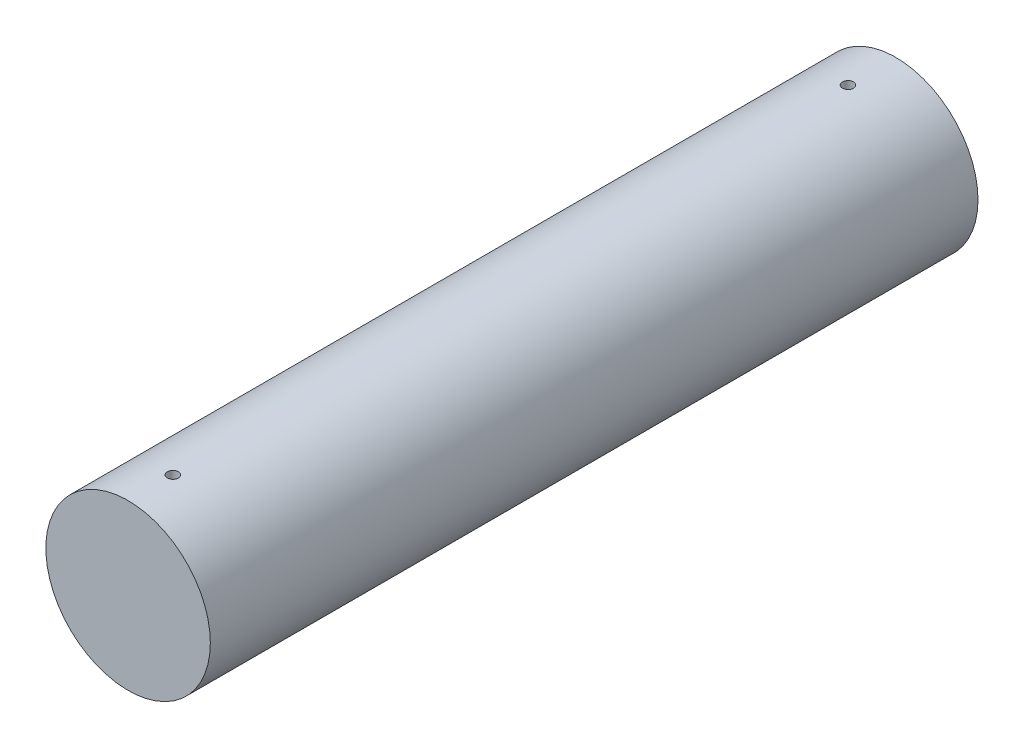
ISO-10303-21;
HEADER;
FILE_DESCRIPTION(('STEP AP214'),'2;1');
FILE_NAME('part.step','',(''),(''),'','','');
FILE_SCHEMA(('AUTOMOTIVE_DESIGN { 1 0 10303 214 1 1 1 1 }'));
ENDSEC;
DATA;
#1=APPLICATION_CONTEXT('core data for automotive mechanical design processes');
#2=APPLICATION_PROTOCOL_DEFINITION('international standard','automotive_design',2000,#1);
#3=PRODUCT_CONTEXT('',#1,'mechanical');
#4=PRODUCT('Part','Part','',(#3));
#5=PRODUCT_RELATED_PRODUCT_CATEGORY('part','',(#4));
#6=PRODUCT_DEFINITION_FORMATION('','',#4);
#7=PRODUCT_DEFINITION_CONTEXT('part definition',#1,'design');
#8=PRODUCT_DEFINITION('design','',#6,#7);
#9=PRODUCT_DEFINITION_SHAPE('','',#8);
#10=(LENGTH_UNIT() NAMED_UNIT(*) SI_UNIT(.MILLI.,.METRE.));
#11=(NAMED_UNIT(*) PLANE_ANGLE_UNIT() SI_UNIT($,.RADIAN.));
#12=(NAMED_UNIT(*) SI_UNIT($,.STERADIAN.) SOLID_ANGLE_UNIT());
#13=UNCERTAINTY_MEASURE_WITH_UNIT(LENGTH_MEASURE(1.E-05),#10,'distance_accuracy_value','');
#14=(GEOMETRIC_REPRESENTATION_CONTEXT(3) GLOBAL_UNCERTAINTY_ASSIGNED_CONTEXT((#13)) GLOBAL_UNIT_ASSIGNED_CONTEXT((#10,
#11,#12)) REPRESENTATION_CONTEXT('',''));
#15=CARTESIAN_POINT('',(0.,0.,0.));
#16=DIRECTION('',(0.,0.,1.));
#17=DIRECTION('',(1.,0.,0.));
#18=AXIS2_PLACEMENT_3D('',#15,#16,#17);
#19=CARTESIAN_POINT('',(0.,0.,700.));
#20=DIRECTION('',(0.,0.,-1.));
#21=DIRECTION('',(-1.,0.,0.));
#22=AXIS2_PLACEMENT_3D('',#19,#20,#21);
#23=CYLINDRICAL_SURFACE('',#22,75.);
#24=CARTESIAN_POINT('',(0.,-75.,664.262651619664));
#25=CARTESIAN_POINT('',(0.140309097466806,-75.0000002142623,664.262652786667));
#26=CARTESIAN_POINT('',(0.280599661851319,-74.9996054525654,664.256743286183));
#27=CARTESIAN_POINT('',(0.560228122354219,-74.9980378910327,664.233147683491));
#28=CARTESIAN_POINT('',(0.699565768668017,-74.9968648945306,664.215458604485));
#29=CARTESIAN_POINT('',(0.976366792558886,-74.9937723135742,664.168406906699));
#30=CARTESIAN_POINT('',(1.11382847572406,-74.9918520951518,664.139034374815));
#31=CARTESIAN_POINT('',(1.38583180784089,-74.9873187869064,664.068814938189));
#32=CARTESIAN_POINT('',(1.52037236964976,-74.9847054437505,664.027963837775));
#33=CARTESIAN_POINT('',(1.7854045781585,-74.9788629279762,663.935127213686));
#34=CARTESIAN_POINT('',(1.91589977424419,-74.975634314059,663.88315178631));
#35=CARTESIAN_POINT('',(2.17209218694026,-74.968649744152,663.768395024603));
#36=CARTESIAN_POINT('',(2.29778761648233,-74.9648935941364,663.705609712509));
#37=CARTESIAN_POINT('',(2.54336741338075,-74.9569634447306,663.569734554365));
#38=CARTESIAN_POINT('',(2.66325520712709,-74.9527896962832,663.496650886139));
#39=CARTESIAN_POINT('',(2.89649799773825,-74.9441387055542,663.340640340649));
#40=CARTESIAN_POINT('',(3.00985056305832,-74.9396613516422,663.257709834364));
#41=CARTESIAN_POINT('',(3.22929868522604,-74.9305258660933,663.082516096984));
#42=CARTESIAN_POINT('',(3.33538597969088,-74.9258675377759,662.990242526589));
#43=CARTESIAN_POINT('',(3.53945256212238,-74.9165049575525,662.797057340851));
#44=CARTESIAN_POINT('',(3.63742884029323,-74.9118006893167,662.696142546974));
#45=CARTESIAN_POINT('',(3.8245059361272,-74.9024827735211,662.486452138175));
#46=CARTESIAN_POINT('',(3.91360964113651,-74.8978690968756,662.377679100528));
#47=CARTESIAN_POINT('',(4.08237803772129,-74.8888598915233,662.152970177327));
#48=CARTESIAN_POINT('',(4.16203923307435,-74.8844644439669,662.037031662679));
#49=CARTESIAN_POINT('',(4.31135978107555,-74.8760160211824,661.798780888551));
#50=CARTESIAN_POINT('',(4.38101356268214,-74.8719632372248,661.676465130152));
#51=CARTESIAN_POINT('',(4.50979330078907,-74.8643167797411,661.426343250814));
#52=CARTESIAN_POINT('',(4.56891535531324,-74.860723276516,661.298535116642));
#53=CARTESIAN_POINT('',(4.67615623582472,-74.8541011443197,661.038414917157));
#54=CARTESIAN_POINT('',(4.7242792236099,-74.8510723017738,660.90610457722));
#55=CARTESIAN_POINT('',(4.80921896313872,-74.8456625066541,660.637875913649));
#56=CARTESIAN_POINT('',(4.84603154191175,-74.843281793244,660.501956278411));
#57=CARTESIAN_POINT('',(4.93892346609777,-74.8372307668651,660.090737687158));
#58=CARTESIAN_POINT('',(4.97773600736569,-74.8346337485122,659.81130038798));
#59=CARTESIAN_POINT('',(5.00788806213435,-74.8326215616604,659.25001772025));
#60=CARTESIAN_POINT('',(4.99922817577027,-74.8332063529378,658.968172382185));
#61=CARTESIAN_POINT('',(4.93480047140913,-74.8374824103477,658.41036357694));
#62=CARTESIAN_POINT('',(4.87910802554584,-74.841168706122,658.134391422693));
#63=CARTESIAN_POINT('',(4.72229658614057,-74.851225989118,657.595732129575));
#64=CARTESIAN_POINT('',(4.6211772898544,-74.8575969942318,657.333045079254));
#65=CARTESIAN_POINT('',(4.37630158009315,-74.8723110865371,656.828157562337));
#66=CARTESIAN_POINT('',(4.23251103339704,-74.8806557513928,656.585973696563));
#67=CARTESIAN_POINT('',(3.90639803709198,-74.8983753551486,656.129152338718));
#68=CARTESIAN_POINT('',(3.72407509267484,-74.9077503072782,655.914515200439));
#69=CARTESIAN_POINT('',(3.32564878468843,-74.9264960886397,655.518440504709));
#70=CARTESIAN_POINT('',(3.10948018577249,-74.9358668741139,655.337068561072));
#71=CARTESIAN_POINT('',(2.6497272135033,-74.9535307835251,655.013179318679));
#72=CARTESIAN_POINT('',(2.40614282928457,-74.9618239070351,654.870662035322));
#73=CARTESIAN_POINT('',(1.89843247226829,-74.9763988097376,654.628532880183));
#74=CARTESIAN_POINT('',(1.63430527507026,-74.9826804689275,654.528923568136));
#75=CARTESIAN_POINT('',(1.09302498078505,-74.9925230471413,654.375482120778));
#76=CARTESIAN_POINT('',(0.815872056792231,-74.9960840023087,654.321649377339));
#77=CARTESIAN_POINT('',(0.2569768554895,-75.0000792671833,654.261370648366));
#78=CARTESIAN_POINT('',(-0.0247555983855488,-75.0005195615152,654.254833960661));
#79=CARTESIAN_POINT('',(-0.585312858226678,-74.9982398216164,654.289095802122));
#80=CARTESIAN_POINT('',(-0.864137681430661,-74.9955198061323,654.329894050502));
#81=CARTESIAN_POINT('',(-1.41070880311822,-74.9872294467462,654.45759251706));
#82=CARTESIAN_POINT('',(-1.67846488427835,-74.9816616805624,654.544451045148));
#83=CARTESIAN_POINT('',(-2.19560003833741,-74.9683020439888,654.761762164497));
#84=CARTESIAN_POINT('',(-2.44497892340134,-74.9605101508699,654.892215201267));
#85=CARTESIAN_POINT('',(-2.91869566338917,-74.9435624933126,655.193242357636));
#86=CARTESIAN_POINT('',(-3.14299500423924,-74.9344046802577,655.363876968236));
#87=CARTESIAN_POINT('',(-3.55979761406041,-74.915762390613,655.740336653248));
#88=CARTESIAN_POINT('',(-3.75230052788653,-74.9062779103758,655.946162120666));
#89=CARTESIAN_POINT('',(-4.10035416778083,-74.8880337793342,656.387548880683));
#90=CARTESIAN_POINT('',(-4.25584598925372,-74.8792752982326,656.623156672708));
#91=CARTESIAN_POINT('',(-4.52505903306866,-74.8634898260947,657.117200695533));
#92=CARTESIAN_POINT('',(-4.63878054167474,-74.8564628231922,657.37563676987));
#93=CARTESIAN_POINT('',(-4.82112861711831,-74.8449403721188,657.907735150177));
#94=CARTESIAN_POINT('',(-4.88979207451111,-74.8404428534058,658.181384800639));
#95=CARTESIAN_POINT('',(-4.98017484611744,-74.834484081991,658.736512768525));
#96=CARTESIAN_POINT('',(-5.00189470292963,-74.8330227941948,659.017990995425));
#97=CARTESIAN_POINT('',(-4.99885527855369,-74.8332233940056,659.439391653871));
#98=CARTESIAN_POINT('',(-4.99191643673334,-74.8336882886248,659.579661119362));
#99=CARTESIAN_POINT('',(-4.96627572312488,-74.8353947208124,659.859101989463));
#100=CARTESIAN_POINT('',(-4.94757820386329,-74.8366359710085,659.998273781092));
#101=CARTESIAN_POINT('',(-4.89854032446997,-74.8398616831956,660.274584875579));
#102=CARTESIAN_POINT('',(-4.86819566729886,-74.8418464194783,660.411723408881));
#103=CARTESIAN_POINT('',(-4.79609789208626,-74.8465012566181,660.682904645106));
#104=CARTESIAN_POINT('',(-4.75434896910654,-74.8491711054347,660.816948466795));
#105=CARTESIAN_POINT('',(-4.65971948772504,-74.8551218025797,661.081085875554));
#106=CARTESIAN_POINT('',(-4.60683502586751,-74.8584028651166,661.21117805907));
#107=CARTESIAN_POINT('',(-4.490342625321,-74.8654808635214,661.466396701432));
#108=CARTESIAN_POINT('',(-4.42673863049181,-74.8692776095631,661.591524965729));
#109=CARTESIAN_POINT('',(-4.28922238053104,-74.8772816957576,661.836025070392));
#110=CARTESIAN_POINT('',(-4.2153066184035,-74.8814891754527,661.955394933679));
#111=CARTESIAN_POINT('',(-4.05773644480292,-74.8901929225954,662.187448557121));
#112=CARTESIAN_POINT('',(-3.97408560947426,-74.8946890837265,662.300134749676));
#113=CARTESIAN_POINT('',(-3.7974199368615,-74.9038546393966,662.518315686261));
#114=CARTESIAN_POINT('',(-3.70438488578406,-74.9085243935924,662.623794048439));
#115=CARTESIAN_POINT('',(-3.50979940307429,-74.9178936542641,662.826503418249));
#116=CARTESIAN_POINT('',(-3.40825211066732,-74.9225931491861,662.923737439927));
#117=CARTESIAN_POINT('',(-3.19726521769517,-74.9318934063755,663.109371126658));
#118=CARTESIAN_POINT('',(-3.08782081434678,-74.9364941063141,663.197765336306));
#119=CARTESIAN_POINT('',(-2.86191065606887,-74.9454617637456,663.364993684085));
#120=CARTESIAN_POINT('',(-2.74544750640933,-74.9498288068465,663.443831337164));
#121=CARTESIAN_POINT('',(-2.50608067203498,-74.9582145124586,663.591551328823));
#122=CARTESIAN_POINT('',(-2.38316626681391,-74.962232563598,663.660416332478));
#123=CARTESIAN_POINT('',(-2.13200113257577,-74.9697962473238,663.787513389988));
#124=CARTESIAN_POINT('',(-2.00375237478967,-74.9733420524218,663.845749329538));
#125=CARTESIAN_POINT('',(-1.74289730688684,-74.9798593681947,663.951156585765));
#126=CARTESIAN_POINT('',(-1.61029484285664,-74.9828313706044,663.998337383899));
#127=CARTESIAN_POINT('',(-1.3416176363287,-74.9881198589993,664.081347714749));
#128=CARTESIAN_POINT('',(-1.20554378943699,-74.9904365122347,664.117180143937));
#129=CARTESIAN_POINT('',(-0.892938525441979,-74.9948887353417,664.18553935565));
#130=CARTESIAN_POINT('',(-0.715596937189605,-74.996798250881,664.214430503079));
#131=CARTESIAN_POINT('',(-0.358826797775219,-74.9993537452255,664.252985873692));
#132=CARTESIAN_POINT('',(-0.179398249942198,-74.9999997260458,664.262650127541));
#133=CARTESIAN_POINT('',(0.,-75.,664.262651619664));
#134=B_SPLINE_CURVE_WITH_KNOTS('',3,(#24,#25,#26,#27,#28,#29,#30,#31,#32,#33,#34,#35,#36,#37,
#38,#39,#40,#41,#42,#43,#44,#45,#46,#47,#48,#49,#50,#51,#52,#53,#54,#55,#56,#57,#58,#59,#60,#61,
#62,#63,#64,#65,#66,#67,#68,#69,#70,#71,#72,#73,#74,#75,#76,#77,#78,#79,#80,#81,#82,#83,#84,#85,
#86,#87,#88,#89,#90,#91,#92,#93,#94,#95,#96,#97,#98,#99,#100,#101,#102,#103,#104,#105,#106,#107,
#108,#109,#110,#111,#112,#113,#114,#115,#116,#117,#118,#119,#120,#121,#122,#123,#124,#125,#126,
#127,#128,#129,#130,#131,#132,#133),.UNSPECIFIED.,.T.,.F.,(4,2,2,2,2,2,2,2,2,2,2,2,2,2,2,2,2,2,
2,2,2,2,2,2,2,2,2,2,2,2,2,2,2,2,2,2,2,2,2,2,2,2,2,2,2,2,2,2,2,2,2,2,2,2,4),(0.,
0.420770514295968,0.841647401180651,1.26288215542827,1.68427108109799,2.10527916914108,
2.52644250986049,2.94735426839671,3.36842163697439,3.78996017178945,4.21165443436656,
4.63321101602462,5.0549232005823,5.47686924654402,5.89897129868547,6.32091337158426,
6.74301093340767,7.58503195248827,8.42704232696327,9.26770589080927,10.1083750572844,
10.949718505614,11.7910727585898,12.6340690977974,13.4770657711035,14.3201127275758,
15.1631484842557,16.0045670767168,16.8459806779845,17.6866339954179,18.5272959040545,
19.3692315631886,20.2111766255494,21.054452848191,21.897723291509,22.7403024564356,
23.5828718823402,24.0037877483546,24.4245479021268,24.8454634385803,25.2662243491793,
25.6871329997355,26.107887129071,26.5287847058528,26.9495281525763,27.3711980701731,
27.7927131587712,28.2144867965581,28.6361048302076,29.0584471625143,29.4806347874443,
29.9024589862439,30.3241754348709,30.8621705873475,31.4001648817647),.UNSPECIFIED.);
#135=CARTESIAN_POINT('',(0.,-75.,664.262651619664));
#136=VERTEX_POINT('',#135);
#137=EDGE_CURVE('E10',#136,#136,#134,.T.);
#138=ORIENTED_EDGE('',*,*,#137,.T.);
#139=EDGE_LOOP('',(#138));
#140=FACE_BOUND('',#139,.T.);
#141=CARTESIAN_POINT('',(0.,75.,664.262651619664));
#142=CARTESIAN_POINT('',(-0.140309097466806,75.0000002142623,664.262652786667));
#143=CARTESIAN_POINT('',(-0.280599661851319,74.9996054525654,664.256743286183));
#144=CARTESIAN_POINT('',(-0.560228122354219,74.9980378910327,664.233147683491));
#145=CARTESIAN_POINT('',(-0.699565768668017,74.9968648945306,664.215458604485));
#146=CARTESIAN_POINT('',(-0.976366792558886,74.9937723135742,664.168406906699));
#147=CARTESIAN_POINT('',(-1.11382847572406,74.9918520951518,664.139034374815));
#148=CARTESIAN_POINT('',(-1.38583180784089,74.9873187869064,664.068814938189));
#149=CARTESIAN_POINT('',(-1.52037236964976,74.9847054437505,664.027963837775));
#150=CARTESIAN_POINT('',(-1.7854045781585,74.9788629279762,663.935127213686));
#151=CARTESIAN_POINT('',(-1.91589977424419,74.975634314059,663.88315178631));
#152=CARTESIAN_POINT('',(-2.17209218694026,74.968649744152,663.768395024603));
#153=CARTESIAN_POINT('',(-2.29778761648233,74.9648935941364,663.705609712509));
#154=CARTESIAN_POINT('',(-2.54336741338075,74.9569634447306,663.569734554365));
#155=CARTESIAN_POINT('',(-2.66325520712709,74.9527896962832,663.496650886139));
#156=CARTESIAN_POINT('',(-2.89649799773825,74.9441387055542,663.340640340649));
#157=CARTESIAN_POINT('',(-3.00985056305832,74.9396613516422,663.257709834364));
#158=CARTESIAN_POINT('',(-3.22929868522604,74.9305258660933,663.082516096984));
#159=CARTESIAN_POINT('',(-3.33538597969088,74.9258675377759,662.990242526589));
#160=CARTESIAN_POINT('',(-3.53945256212238,74.9165049575525,662.797057340851));
#161=CARTESIAN_POINT('',(-3.63742884029323,74.9118006893167,662.696142546974));
#162=CARTESIAN_POINT('',(-3.8245059361272,74.9024827735211,662.486452138175));
#163=CARTESIAN_POINT('',(-3.91360964113651,74.8978690968756,662.377679100528));
#164=CARTESIAN_POINT('',(-4.08237803772129,74.8888598915233,662.152970177327));
#165=CARTESIAN_POINT('',(-4.16203923307435,74.8844644439669,662.037031662679));
#166=CARTESIAN_POINT('',(-4.31135978107555,74.8760160211824,661.798780888551));
#167=CARTESIAN_POINT('',(-4.38101356268214,74.8719632372248,661.676465130152));
#168=CARTESIAN_POINT('',(-4.50979330078907,74.8643167797411,661.426343250814));
#169=CARTESIAN_POINT('',(-4.56891535531324,74.860723276516,661.298535116642));
#170=CARTESIAN_POINT('',(-4.67615623582472,74.8541011443197,661.038414917157));
#171=CARTESIAN_POINT('',(-4.7242792236099,74.8510723017738,660.90610457722));
#172=CARTESIAN_POINT('',(-4.80921896313872,74.8456625066541,660.637875913649));
#173=CARTESIAN_POINT('',(-4.84603154191175,74.843281793244,660.501956278411));
#174=CARTESIAN_POINT('',(-4.93892346609777,74.8372307668651,660.090737687158));
#175=CARTESIAN_POINT('',(-4.97773600736569,74.8346337485122,659.81130038798));
#176=CARTESIAN_POINT('',(-5.00788806213435,74.8326215616604,659.25001772025));
#177=CARTESIAN_POINT('',(-4.99922817577027,74.8332063529378,658.968172382185));
#178=CARTESIAN_POINT('',(-4.93480047140913,74.8374824103477,658.41036357694));
#179=CARTESIAN_POINT('',(-4.87910802554584,74.841168706122,658.134391422693));
#180=CARTESIAN_POINT('',(-4.72229658614057,74.851225989118,657.595732129575));
#181=CARTESIAN_POINT('',(-4.6211772898544,74.8575969942318,657.333045079254));
#182=CARTESIAN_POINT('',(-4.37630158009315,74.8723110865371,656.828157562337));
#183=CARTESIAN_POINT('',(-4.23251103339704,74.8806557513928,656.585973696563));
#184=CARTESIAN_POINT('',(-3.90639803709198,74.8983753551486,656.129152338718));
#185=CARTESIAN_POINT('',(-3.72407509267484,74.9077503072782,655.914515200439));
#186=CARTESIAN_POINT('',(-3.32564878468843,74.9264960886397,655.518440504709));
#187=CARTESIAN_POINT('',(-3.10948018577249,74.9358668741139,655.337068561072));
#188=CARTESIAN_POINT('',(-2.6497272135033,74.9535307835251,655.013179318679));
#189=CARTESIAN_POINT('',(-2.40614282928457,74.9618239070351,654.870662035322));
#190=CARTESIAN_POINT('',(-1.89843247226829,74.9763988097376,654.628532880183));
#191=CARTESIAN_POINT('',(-1.63430527507026,74.9826804689275,654.528923568136));
#192=CARTESIAN_POINT('',(-1.09302498078505,74.9925230471413,654.375482120778));
#193=CARTESIAN_POINT('',(-0.815872056792231,74.9960840023087,654.321649377339));
#194=CARTESIAN_POINT('',(-0.2569768554895,75.0000792671833,654.261370648366));
#195=CARTESIAN_POINT('',(0.0247555983855488,75.0005195615152,654.254833960661));
#196=CARTESIAN_POINT('',(0.585312858226678,74.9982398216164,654.289095802122));
#197=CARTESIAN_POINT('',(0.864137681430661,74.9955198061323,654.329894050502));
#198=CARTESIAN_POINT('',(1.41070880311822,74.9872294467462,654.45759251706));
#199=CARTESIAN_POINT('',(1.67846488427835,74.9816616805624,654.544451045148));
#200=CARTESIAN_POINT('',(2.19560003833741,74.9683020439888,654.761762164497));
#201=CARTESIAN_POINT('',(2.44497892340134,74.9605101508699,654.892215201267));
#202=CARTESIAN_POINT('',(2.91869566338917,74.9435624933126,655.193242357636));
#203=CARTESIAN_POINT('',(3.14299500423924,74.9344046802577,655.363876968236));
#204=CARTESIAN_POINT('',(3.55979761406041,74.915762390613,655.740336653248));
#205=CARTESIAN_POINT('',(3.75230052788653,74.9062779103758,655.946162120666));
#206=CARTESIAN_POINT('',(4.10035416778083,74.8880337793342,656.387548880683));
#207=CARTESIAN_POINT('',(4.25584598925372,74.8792752982326,656.623156672708));
#208=CARTESIAN_POINT('',(4.52505903306866,74.8634898260947,657.117200695533));
#209=CARTESIAN_POINT('',(4.63878054167474,74.8564628231922,657.37563676987));
#210=CARTESIAN_POINT('',(4.82112861711831,74.8449403721188,657.907735150177));
#211=CARTESIAN_POINT('',(4.88979207451111,74.8404428534058,658.181384800639));
#212=CARTESIAN_POINT('',(4.98017484611744,74.834484081991,658.736512768525));
#213=CARTESIAN_POINT('',(5.00189470292963,74.8330227941948,659.017990995425));
#214=CARTESIAN_POINT('',(4.99885527855369,74.8332233940056,659.439391653871));
#215=CARTESIAN_POINT('',(4.99191643673334,74.8336882886248,659.579661119362));
#216=CARTESIAN_POINT('',(4.96627572312488,74.8353947208124,659.859101989463));
#217=CARTESIAN_POINT('',(4.94757820386329,74.8366359710085,659.998273781092));
#218=CARTESIAN_POINT('',(4.89854032446997,74.8398616831956,660.274584875579));
#219=CARTESIAN_POINT('',(4.86819566729886,74.8418464194783,660.411723408881));
#220=CARTESIAN_POINT('',(4.79609789208626,74.8465012566181,660.682904645106));
#221=CARTESIAN_POINT('',(4.75434896910654,74.8491711054347,660.816948466795));
#222=CARTESIAN_POINT('',(4.65971948772504,74.8551218025797,661.081085875554));
#223=CARTESIAN_POINT('',(4.60683502586751,74.8584028651166,661.21117805907));
#224=CARTESIAN_POINT('',(4.490342625321,74.8654808635214,661.466396701432));
#225=CARTESIAN_POINT('',(4.42673863049181,74.8692776095631,661.591524965729));
#226=CARTESIAN_POINT('',(4.28922238053104,74.8772816957576,661.836025070392));
#227=CARTESIAN_POINT('',(4.2153066184035,74.8814891754527,661.955394933679));
#228=CARTESIAN_POINT('',(4.05773644480292,74.8901929225954,662.187448557121));
#229=CARTESIAN_POINT('',(3.97408560947426,74.8946890837265,662.300134749676));
#230=CARTESIAN_POINT('',(3.7974199368615,74.9038546393966,662.518315686261));
#231=CARTESIAN_POINT('',(3.70438488578406,74.9085243935924,662.623794048439));
#232=CARTESIAN_POINT('',(3.50979940307429,74.9178936542641,662.826503418249));
#233=CARTESIAN_POINT('',(3.40825211066732,74.9225931491861,662.923737439927));
#234=CARTESIAN_POINT('',(3.19726521769517,74.9318934063755,663.109371126658));
#235=CARTESIAN_POINT('',(3.08782081434678,74.9364941063141,663.197765336306));
#236=CARTESIAN_POINT('',(2.86191065606887,74.9454617637456,663.364993684085));
#237=CARTESIAN_POINT('',(2.74544750640933,74.9498288068465,663.443831337164));
#238=CARTESIAN_POINT('',(2.50608067203498,74.9582145124586,663.591551328823));
#239=CARTESIAN_POINT('',(2.38316626681391,74.962232563598,663.660416332478));
#240=CARTESIAN_POINT('',(2.13200113257577,74.9697962473238,663.787513389988));
#241=CARTESIAN_POINT('',(2.00375237478967,74.9733420524218,663.845749329538));
#242=CARTESIAN_POINT('',(1.74289730688684,74.9798593681947,663.951156585765));
#243=CARTESIAN_POINT('',(1.61029484285664,74.9828313706044,663.998337383899));
#244=CARTESIAN_POINT('',(1.3416176363287,74.9881198589993,664.081347714749));
#245=CARTESIAN_POINT('',(1.20554378943699,74.9904365122347,664.117180143937));
#246=CARTESIAN_POINT('',(0.892938525441979,74.9948887353417,664.18553935565));
#247=CARTESIAN_POINT('',(0.715596937189605,74.996798250881,664.214430503079));
#248=CARTESIAN_POINT('',(0.358826797775219,74.9993537452255,664.252985873692));
#249=CARTESIAN_POINT('',(0.179398249942198,74.9999997260458,664.262650127541));
#250=CARTESIAN_POINT('',(0.,75.,664.262651619664));
#251=B_SPLINE_CURVE_WITH_KNOTS('',3,(#141,#142,#143,#144,#145,#146,#147,#148,#149,#150,#151,
#152,#153,#154,#155,#156,#157,#158,#159,#160,#161,#162,#163,#164,#165,#166,#167,#168,#169,#170,
#171,#172,#173,#174,#175,#176,#177,#178,#179,#180,#181,#182,#183,#184,#185,#186,#187,#188,#189,
#190,#191,#192,#193,#194,#195,#196,#197,#198,#199,#200,#201,#202,#203,#204,#205,#206,#207,#208,
#209,#210,#211,#212,#213,#214,#215,#216,#217,#218,#219,#220,#221,#222,#223,#224,#225,#226,#227,
#228,#229,#230,#231,#232,#233,#234,#235,#236,#237,#238,#239,#240,#241,#242,#243,#244,#245,#246,
#247,#248,#249,#250),.UNSPECIFIED.,.T.,.F.,(4,2,2,2,2,2,2,2,2,2,2,2,2,2,2,2,2,2,2,2,2,2,2,2,2,2,
2,2,2,2,2,2,2,2,2,2,2,2,2,2,2,2,2,2,2,2,2,2,2,2,2,2,2,2,4),(0.,0.420770514295968,
0.841647401180651,1.26288215542827,1.68427108109799,2.10527916914108,2.52644250986049,
2.94735426839671,3.36842163697439,3.78996017178945,4.21165443436656,4.63321101602462,
5.0549232005823,5.47686924654402,5.89897129868547,6.32091337158426,6.74301093340767,
7.58503195248827,8.42704232696327,9.26770589080927,10.1083750572844,10.949718505614,
11.7910727585898,12.6340690977974,13.4770657711035,14.3201127275758,15.1631484842557,
16.0045670767168,16.8459806779845,17.6866339954179,18.5272959040545,19.3692315631886,
20.2111766255494,21.054452848191,21.897723291509,22.7403024564356,23.5828718823402,
24.0037877483546,24.4245479021268,24.8454634385803,25.2662243491793,25.6871329997355,
26.107887129071,26.5287847058528,26.9495281525763,27.3711980701731,27.7927131587712,
28.2144867965581,28.6361048302076,29.0584471625143,29.4806347874443,29.9024589862439,
30.3241754348709,30.8621705873475,31.4001648817647),.UNSPECIFIED.);
#252=CARTESIAN_POINT('',(0.,75.,664.262651619664));
#253=VERTEX_POINT('',#252);
#254=EDGE_CURVE('E42',#253,#253,#251,.T.);
#255=ORIENTED_EDGE('',*,*,#254,.T.);
#256=EDGE_LOOP('',(#255));
#257=FACE_BOUND('',#256,.T.);
#258=CARTESIAN_POINT('',(0.,-75.,48.6321625920649));
#259=CARTESIAN_POINT('',(0.140309097466807,-75.0000002142623,48.6321637590686));
#260=CARTESIAN_POINT('',(0.280599661851318,-74.9996054525654,48.6262542585845));
#261=CARTESIAN_POINT('',(0.56022812235422,-74.9980378910327,48.6026586558921));
#262=CARTESIAN_POINT('',(0.699565768668021,-74.9968648945306,48.5849695768862));
#263=CARTESIAN_POINT('',(0.976366792558885,-74.9937723135742,48.5379178791003));
#264=CARTESIAN_POINT('',(1.11382847572406,-74.9918520951518,48.5085453472165));
#265=CARTESIAN_POINT('',(1.38583180784088,-74.9873187869064,48.4383259105905));
#266=CARTESIAN_POINT('',(1.52037236964976,-74.9847054437505,48.3974748101758));
#267=CARTESIAN_POINT('',(1.7854045781585,-74.9788629279762,48.3046381860878));
#268=CARTESIAN_POINT('',(1.91589977424418,-74.975634314059,48.2526627587115));
#269=CARTESIAN_POINT('',(2.17209218694025,-74.968649744152,48.137905997004));
#270=CARTESIAN_POINT('',(2.29778761648233,-74.9648935941364,48.07512068491));
#271=CARTESIAN_POINT('',(2.54336741338075,-74.9569634447306,47.9392455267663));
#272=CARTESIAN_POINT('',(2.66325520712709,-74.9527896962832,47.8661618585399));
#273=CARTESIAN_POINT('',(2.89649799773825,-74.9441387055542,47.7101513130503));
#274=CARTESIAN_POINT('',(3.00985056305831,-74.9396613516422,47.6272208067656));
#275=CARTESIAN_POINT('',(3.22929868522602,-74.9305258660933,47.4520270693853));
#276=CARTESIAN_POINT('',(3.33538597969087,-74.9258675377759,47.3597534989899));
#277=CARTESIAN_POINT('',(3.53945256212236,-74.9165049575525,47.1665683132521));
#278=CARTESIAN_POINT('',(3.63742884029321,-74.9118006893167,47.0656535193749));
#279=CARTESIAN_POINT('',(3.82450593612713,-74.9024827735211,46.8559631105768));
#280=CARTESIAN_POINT('',(3.91360964113639,-74.8978690968756,46.7471900729294));
#281=CARTESIAN_POINT('',(4.08237803772118,-74.8888598915233,46.5224811497289));
#282=CARTESIAN_POINT('',(4.16203923307428,-74.8844644439669,46.4065426350805));
#283=CARTESIAN_POINT('',(4.31135978107551,-74.8760160211824,46.1682918609527));
#284=CARTESIAN_POINT('',(4.38101356268208,-74.8719632372248,46.0459761025538));
#285=CARTESIAN_POINT('',(4.50979330078902,-74.8643167797411,45.7958542232151));
#286=CARTESIAN_POINT('',(4.5689153553132,-74.860723276516,45.6680460890433));
#287=CARTESIAN_POINT('',(4.67615623582471,-74.8541011443196,45.4079258895584));
#288=CARTESIAN_POINT('',(4.72427922360987,-74.8510723017738,45.2756155496217));
#289=CARTESIAN_POINT('',(4.80921896313871,-74.8456625066541,45.00738688605));
#290=CARTESIAN_POINT('',(4.84603154191175,-74.843281793244,44.8714672508126));
#291=CARTESIAN_POINT('',(4.93892346609777,-74.8372307668651,44.4602486595592));
#292=CARTESIAN_POINT('',(4.97773600736569,-74.8346337485122,44.1808113603817));
#293=CARTESIAN_POINT('',(5.00788806213435,-74.8326215616604,43.6195286926517));
#294=CARTESIAN_POINT('',(4.99922817577027,-74.8332063529378,43.337683354586));
#295=CARTESIAN_POINT('',(4.93480047140913,-74.8374824103477,42.7798745493415));
#296=CARTESIAN_POINT('',(4.87910802554584,-74.841168706122,42.5039023950945));
#297=CARTESIAN_POINT('',(4.72229658614057,-74.851225989118,41.965243101976));
#298=CARTESIAN_POINT('',(4.62117728985438,-74.8575969942318,41.7025560516552));
#299=CARTESIAN_POINT('',(4.37630158009311,-74.8723110865371,41.1976685347383));
#300=CARTESIAN_POINT('',(4.232511033397,-74.8806557513928,40.9554846689648));
#301=CARTESIAN_POINT('',(3.90639803709194,-74.8983753551486,40.4986633111189));
#302=CARTESIAN_POINT('',(3.72407509267482,-74.9077503072782,40.2840261728407));
#303=CARTESIAN_POINT('',(3.32564878468843,-74.9264960886397,39.8879514771102));
#304=CARTESIAN_POINT('',(3.1094801857725,-74.9358668741139,39.7065795334735));
#305=CARTESIAN_POINT('',(2.64972721350331,-74.9535307835251,39.3826902910806));
#306=CARTESIAN_POINT('',(2.40614282928459,-74.9618239070351,39.2401730077233));
#307=CARTESIAN_POINT('',(1.89843247226835,-74.9763988097376,38.9980438525845));
#308=CARTESIAN_POINT('',(1.63430527507035,-74.9826804689275,38.898434540537));
#309=CARTESIAN_POINT('',(1.09302498078513,-74.9925230471413,38.7449930931789));
#310=CARTESIAN_POINT('',(0.815872056792275,-74.9960840023087,38.6911603497407));
#311=CARTESIAN_POINT('',(0.256976855489507,-75.0000792671833,38.6308816207672));
#312=CARTESIAN_POINT('',(-0.0247555983855453,-75.0005195615152,38.6243449330622));
#313=CARTESIAN_POINT('',(-0.585312858226677,-74.9982398216164,38.6586067745236));
#314=CARTESIAN_POINT('',(-0.86413768143066,-74.9955198061323,38.6994050229033));
#315=CARTESIAN_POINT('',(-1.41070880311822,-74.9872294467462,38.8271034894616));
#316=CARTESIAN_POINT('',(-1.67846488427834,-74.9816616805624,38.9139620175489));
#317=CARTESIAN_POINT('',(-2.1956000383374,-74.9683020439888,39.131273136898));
#318=CARTESIAN_POINT('',(-2.44497892340132,-74.9605101508699,39.2617261736679));
#319=CARTESIAN_POINT('',(-2.91869566338916,-74.9435624933126,39.5627533300368));
#320=CARTESIAN_POINT('',(-3.14299500423923,-74.9344046802577,39.7333879406372));
#321=CARTESIAN_POINT('',(-3.55979761406042,-74.915762390613,40.1098476256492));
#322=CARTESIAN_POINT('',(-3.75230052788654,-74.9062779103758,40.3156730930671));
#323=CARTESIAN_POINT('',(-4.10035416778081,-74.8880337793342,40.7570598530843));
#324=CARTESIAN_POINT('',(-4.25584598925367,-74.8792752982326,40.9926676451091));
#325=CARTESIAN_POINT('',(-4.52505903306862,-74.8634898260947,41.4867116679344));
#326=CARTESIAN_POINT('',(-4.63878054167472,-74.8564628231922,41.7451477422711));
#327=CARTESIAN_POINT('',(-4.82112861711833,-74.8449403721188,42.2772461225779));
#328=CARTESIAN_POINT('',(-4.88979207451113,-74.8404428534058,42.55089577304));
#329=CARTESIAN_POINT('',(-4.98017484611745,-74.834484081991,43.1060237409267));
#330=CARTESIAN_POINT('',(-5.00189470292964,-74.8330227941948,43.3875019678264));
#331=CARTESIAN_POINT('',(-4.99885527855369,-74.8332233940056,43.8089026262724));
#332=CARTESIAN_POINT('',(-4.99191643673333,-74.8336882886248,43.9491720917629));
#333=CARTESIAN_POINT('',(-4.96627572312486,-74.8353947208124,44.2286129618648));
#334=CARTESIAN_POINT('',(-4.94757820386328,-74.8366359710085,44.3677847534929));
#335=CARTESIAN_POINT('',(-4.89854032446996,-74.8398616831956,44.6440958479807));
#336=CARTESIAN_POINT('',(-4.86819566729884,-74.8418464194782,44.7812343812822));
#337=CARTESIAN_POINT('',(-4.79609789208626,-74.8465012566181,45.0524156175075));
#338=CARTESIAN_POINT('',(-4.75434896910655,-74.8491711054347,45.1864594391963));
#339=CARTESIAN_POINT('',(-4.65971948772507,-74.8551218025797,45.4505968479556));
#340=CARTESIAN_POINT('',(-4.60683502586753,-74.8584028651166,45.5806890314713));
#341=CARTESIAN_POINT('',(-4.49034262532103,-74.8654808635214,45.8359076738329));
#342=CARTESIAN_POINT('',(-4.42673863049184,-74.8692776095631,45.9610359381303));
#343=CARTESIAN_POINT('',(-4.28922238053106,-74.8772816957576,46.2055360427932));
#344=CARTESIAN_POINT('',(-4.2153066184035,-74.8814891754527,46.3249059060807));
#345=CARTESIAN_POINT('',(-4.0577364448029,-74.8901929225954,46.5569595295219));
#346=CARTESIAN_POINT('',(-3.97408560947424,-74.8946890837265,46.6696457220776));
#347=CARTESIAN_POINT('',(-3.79741993686147,-74.9038546393966,46.8878266586619));
#348=CARTESIAN_POINT('',(-3.70438488578406,-74.9085243935924,46.9933050208408));
#349=CARTESIAN_POINT('',(-3.50979940307428,-74.9178936542641,47.1960143906501));
#350=CARTESIAN_POINT('',(-3.40825211066729,-74.9225931491861,47.293248412328));
#351=CARTESIAN_POINT('',(-3.19726521769512,-74.9318934063755,47.4788820990595));
#352=CARTESIAN_POINT('',(-3.08782081434675,-74.9364941063141,47.5672763087068));
#353=CARTESIAN_POINT('',(-2.86191065606886,-74.9454617637456,47.734504656486));
#354=CARTESIAN_POINT('',(-2.74544750640932,-74.9498288068465,47.8133423095654));
#355=CARTESIAN_POINT('',(-2.50608067203496,-74.9582145124586,47.9610623012239));
#356=CARTESIAN_POINT('',(-2.38316626681387,-74.962232563598,48.029927304879));
#357=CARTESIAN_POINT('',(-2.13200113257573,-74.9697962473238,48.1570243623897));
#358=CARTESIAN_POINT('',(-2.00375237478963,-74.9733420524218,48.2152603019396));
#359=CARTESIAN_POINT('',(-1.74289730688682,-74.9798593681947,48.320667558166));
#360=CARTESIAN_POINT('',(-1.61029484285663,-74.9828313706044,48.3678483563008));
#361=CARTESIAN_POINT('',(-1.3416176363287,-74.9881198589993,48.4508586871506));
#362=CARTESIAN_POINT('',(-1.20554378943698,-74.9904365122347,48.4866911163381));
#363=CARTESIAN_POINT('',(-0.892938525441969,-74.9948887353417,48.5550503280509));
#364=CARTESIAN_POINT('',(-0.7155969371896,-74.996798250881,48.5839414754807));
#365=CARTESIAN_POINT('',(-0.358826797775219,-74.9993537452255,48.6224968460935));
#366=CARTESIAN_POINT('',(-0.179398249942197,-74.9999997260458,48.6321610999419));
#367=CARTESIAN_POINT('',(0.,-75.,48.6321625920649));
#368=B_SPLINE_CURVE_WITH_KNOTS('',3,(#258,#259,#260,#261,#262,#263,#264,#265,#266,#267,#268,
#269,#270,#271,#272,#273,#274,#275,#276,#277,#278,#279,#280,#281,#282,#283,#284,#285,#286,#287,
#288,#289,#290,#291,#292,#293,#294,#295,#296,#297,#298,#299,#300,#301,#302,#303,#304,#305,#306,
#307,#308,#309,#310,#311,#312,#313,#314,#315,#316,#317,#318,#319,#320,#321,#322,#323,#324,#325,
#326,#327,#328,#329,#330,#331,#332,#333,#334,#335,#336,#337,#338,#339,#340,#341,#342,#343,#344,
#345,#346,#347,#348,#349,#350,#351,#352,#353,#354,#355,#356,#357,#358,#359,#360,#361,#362,#363,
#364,#365,#366,#367),.UNSPECIFIED.,.T.,.F.,(4,2,2,2,2,2,2,2,2,2,2,2,2,2,2,2,2,2,2,2,2,2,2,2,2,2,
2,2,2,2,2,2,2,2,2,2,2,2,2,2,2,2,2,2,2,2,2,2,2,2,2,2,2,2,4),(0.,0.420770514295964,
0.841647401180657,1.26288215542827,1.68427108109799,2.10527916914107,2.52644250986052,
2.94735426839666,3.36842163697441,3.78996017178945,4.21165443436649,4.63321101602438,
5.05492320058223,5.47686924654385,5.89897129868542,6.32091337158418,6.74301093340768,
7.58503195248819,8.42704232696329,9.26770589080931,10.1083750572844,10.949718505614,
11.7910727585898,12.6340690977973,13.4770657711034,14.3201127275757,15.1631484842557,
16.0045670767168,16.8459806779845,17.6866339954178,18.5272959040545,19.3692315631886,
20.2111766255494,21.0544528481909,21.8977232915089,22.7403024564358,23.5828718823403,
24.0037877483548,24.4245479021268,24.8454634385802,25.2662243491792,25.6871329997354,
26.1078871290708,26.5287847058528,26.9495281525764,27.3711980701731,27.7927131587713,
28.2144867965581,28.6361048302076,29.0584471625143,29.4806347874444,29.9024589862439,
30.3241754348708,30.8621705873475,31.4001648817647),.UNSPECIFIED.);
#369=CARTESIAN_POINT('',(0.,-75.,48.6321625920649));
#370=VERTEX_POINT('',#369);
#371=EDGE_CURVE('E46',#370,#370,#368,.T.);
#372=ORIENTED_EDGE('',*,*,#371,.T.);
#373=EDGE_LOOP('',(#372));
#374=FACE_BOUND('',#373,.T.);
#375=CARTESIAN_POINT('',(0.,75.,48.6321625920649));
#376=CARTESIAN_POINT('',(-0.140309097466807,75.0000002142623,48.6321637590686));
#377=CARTESIAN_POINT('',(-0.280599661851318,74.9996054525654,48.6262542585845));
#378=CARTESIAN_POINT('',(-0.56022812235422,74.9980378910327,48.6026586558921));
#379=CARTESIAN_POINT('',(-0.699565768668021,74.9968648945306,48.5849695768862));
#380=CARTESIAN_POINT('',(-0.976366792558885,74.9937723135742,48.5379178791003));
#381=CARTESIAN_POINT('',(-1.11382847572406,74.9918520951518,48.5085453472165));
#382=CARTESIAN_POINT('',(-1.38583180784088,74.9873187869064,48.4383259105905));
#383=CARTESIAN_POINT('',(-1.52037236964976,74.9847054437505,48.3974748101758));
#384=CARTESIAN_POINT('',(-1.7854045781585,74.9788629279762,48.3046381860878));
#385=CARTESIAN_POINT('',(-1.91589977424418,74.975634314059,48.2526627587115));
#386=CARTESIAN_POINT('',(-2.17209218694025,74.968649744152,48.137905997004));
#387=CARTESIAN_POINT('',(-2.29778761648233,74.9648935941364,48.07512068491));
#388=CARTESIAN_POINT('',(-2.54336741338075,74.9569634447306,47.9392455267663));
#389=CARTESIAN_POINT('',(-2.66325520712709,74.9527896962832,47.8661618585399));
#390=CARTESIAN_POINT('',(-2.89649799773825,74.9441387055542,47.7101513130503));
#391=CARTESIAN_POINT('',(-3.00985056305831,74.9396613516422,47.6272208067656));
#392=CARTESIAN_POINT('',(-3.22929868522602,74.9305258660933,47.4520270693853));
#393=CARTESIAN_POINT('',(-3.33538597969087,74.9258675377759,47.3597534989899));
#394=CARTESIAN_POINT('',(-3.53945256212236,74.9165049575525,47.1665683132521));
#395=CARTESIAN_POINT('',(-3.63742884029321,74.9118006893167,47.0656535193749));
#396=CARTESIAN_POINT('',(-3.82450593612713,74.9024827735211,46.8559631105768));
#397=CARTESIAN_POINT('',(-3.91360964113639,74.8978690968756,46.7471900729294));
#398=CARTESIAN_POINT('',(-4.08237803772118,74.8888598915233,46.5224811497289));
#399=CARTESIAN_POINT('',(-4.16203923307428,74.8844644439669,46.4065426350805));
#400=CARTESIAN_POINT('',(-4.31135978107551,74.8760160211824,46.1682918609527));
#401=CARTESIAN_POINT('',(-4.38101356268208,74.8719632372248,46.0459761025538));
#402=CARTESIAN_POINT('',(-4.50979330078902,74.8643167797411,45.7958542232151));
#403=CARTESIAN_POINT('',(-4.5689153553132,74.860723276516,45.6680460890433));
#404=CARTESIAN_POINT('',(-4.67615623582471,74.8541011443196,45.4079258895584));
#405=CARTESIAN_POINT('',(-4.72427922360987,74.8510723017738,45.2756155496217));
#406=CARTESIAN_POINT('',(-4.80921896313871,74.8456625066541,45.00738688605));
#407=CARTESIAN_POINT('',(-4.84603154191175,74.843281793244,44.8714672508126));
#408=CARTESIAN_POINT('',(-4.93892346609777,74.8372307668651,44.4602486595592));
#409=CARTESIAN_POINT('',(-4.97773600736569,74.8346337485122,44.1808113603817));
#410=CARTESIAN_POINT('',(-5.00788806213435,74.8326215616604,43.6195286926517));
#411=CARTESIAN_POINT('',(-4.99922817577027,74.8332063529378,43.337683354586));
#412=CARTESIAN_POINT('',(-4.93480047140913,74.8374824103477,42.7798745493415));
#413=CARTESIAN_POINT('',(-4.87910802554584,74.841168706122,42.5039023950945));
#414=CARTESIAN_POINT('',(-4.72229658614057,74.851225989118,41.965243101976));
#415=CARTESIAN_POINT('',(-4.62117728985438,74.8575969942318,41.7025560516552));
#416=CARTESIAN_POINT('',(-4.37630158009311,74.8723110865371,41.1976685347383));
#417=CARTESIAN_POINT('',(-4.232511033397,74.8806557513928,40.9554846689648));
#418=CARTESIAN_POINT('',(-3.90639803709194,74.8983753551486,40.4986633111189));
#419=CARTESIAN_POINT('',(-3.72407509267482,74.9077503072782,40.2840261728407));
#420=CARTESIAN_POINT('',(-3.32564878468843,74.9264960886397,39.8879514771102));
#421=CARTESIAN_POINT('',(-3.1094801857725,74.9358668741139,39.7065795334735));
#422=CARTESIAN_POINT('',(-2.64972721350331,74.9535307835251,39.3826902910806));
#423=CARTESIAN_POINT('',(-2.40614282928459,74.9618239070351,39.2401730077233));
#424=CARTESIAN_POINT('',(-1.89843247226835,74.9763988097376,38.9980438525845));
#425=CARTESIAN_POINT('',(-1.63430527507035,74.9826804689275,38.898434540537));
#426=CARTESIAN_POINT('',(-1.09302498078513,74.9925230471413,38.7449930931789));
#427=CARTESIAN_POINT('',(-0.815872056792275,74.9960840023087,38.6911603497407));
#428=CARTESIAN_POINT('',(-0.256976855489507,75.0000792671833,38.6308816207672));
#429=CARTESIAN_POINT('',(0.0247555983855453,75.0005195615152,38.6243449330622));
#430=CARTESIAN_POINT('',(0.585312858226677,74.9982398216164,38.6586067745236));
#431=CARTESIAN_POINT('',(0.86413768143066,74.9955198061323,38.6994050229033));
#432=CARTESIAN_POINT('',(1.41070880311822,74.9872294467462,38.8271034894616));
#433=CARTESIAN_POINT('',(1.67846488427834,74.9816616805624,38.9139620175489));
#434=CARTESIAN_POINT('',(2.1956000383374,74.9683020439888,39.131273136898));
#435=CARTESIAN_POINT('',(2.44497892340132,74.9605101508699,39.2617261736679));
#436=CARTESIAN_POINT('',(2.91869566338916,74.9435624933126,39.5627533300368));
#437=CARTESIAN_POINT('',(3.14299500423923,74.9344046802577,39.7333879406372));
#438=CARTESIAN_POINT('',(3.55979761406042,74.915762390613,40.1098476256492));
#439=CARTESIAN_POINT('',(3.75230052788654,74.9062779103758,40.3156730930671));
#440=CARTESIAN_POINT('',(4.10035416778081,74.8880337793342,40.7570598530843));
#441=CARTESIAN_POINT('',(4.25584598925367,74.8792752982326,40.9926676451091));
#442=CARTESIAN_POINT('',(4.52505903306862,74.8634898260947,41.4867116679344));
#443=CARTESIAN_POINT('',(4.63878054167472,74.8564628231922,41.7451477422711));
#444=CARTESIAN_POINT('',(4.82112861711833,74.8449403721188,42.2772461225779));
#445=CARTESIAN_POINT('',(4.88979207451113,74.8404428534058,42.55089577304));
#446=CARTESIAN_POINT('',(4.98017484611745,74.834484081991,43.1060237409267));
#447=CARTESIAN_POINT('',(5.00189470292964,74.8330227941948,43.3875019678264));
#448=CARTESIAN_POINT('',(4.99885527855369,74.8332233940056,43.8089026262724));
#449=CARTESIAN_POINT('',(4.99191643673333,74.8336882886248,43.9491720917629));
#450=CARTESIAN_POINT('',(4.96627572312486,74.8353947208124,44.2286129618648));
#451=CARTESIAN_POINT('',(4.94757820386328,74.8366359710085,44.3677847534929));
#452=CARTESIAN_POINT('',(4.89854032446996,74.8398616831956,44.6440958479807));
#453=CARTESIAN_POINT('',(4.86819566729884,74.8418464194782,44.7812343812822));
#454=CARTESIAN_POINT('',(4.79609789208626,74.8465012566181,45.0524156175075));
#455=CARTESIAN_POINT('',(4.75434896910655,74.8491711054347,45.1864594391963));
#456=CARTESIAN_POINT('',(4.65971948772507,74.8551218025797,45.4505968479556));
#457=CARTESIAN_POINT('',(4.60683502586753,74.8584028651166,45.5806890314713));
#458=CARTESIAN_POINT('',(4.49034262532103,74.8654808635214,45.8359076738329));
#459=CARTESIAN_POINT('',(4.42673863049184,74.8692776095631,45.9610359381303));
#460=CARTESIAN_POINT('',(4.28922238053106,74.8772816957576,46.2055360427932));
#461=CARTESIAN_POINT('',(4.2153066184035,74.8814891754527,46.3249059060807));
#462=CARTESIAN_POINT('',(4.0577364448029,74.8901929225954,46.5569595295219));
#463=CARTESIAN_POINT('',(3.97408560947424,74.8946890837265,46.6696457220776));
#464=CARTESIAN_POINT('',(3.79741993686147,74.9038546393966,46.8878266586619));
#465=CARTESIAN_POINT('',(3.70438488578406,74.9085243935924,46.9933050208408));
#466=CARTESIAN_POINT('',(3.50979940307428,74.9178936542641,47.1960143906501));
#467=CARTESIAN_POINT('',(3.40825211066729,74.9225931491861,47.293248412328));
#468=CARTESIAN_POINT('',(3.19726521769512,74.9318934063755,47.4788820990595));
#469=CARTESIAN_POINT('',(3.08782081434675,74.9364941063141,47.5672763087068));
#470=CARTESIAN_POINT('',(2.86191065606886,74.9454617637456,47.734504656486));
#471=CARTESIAN_POINT('',(2.74544750640932,74.9498288068465,47.8133423095654));
#472=CARTESIAN_POINT('',(2.50608067203496,74.9582145124586,47.9610623012239));
#473=CARTESIAN_POINT('',(2.38316626681387,74.962232563598,48.029927304879));
#474=CARTESIAN_POINT('',(2.13200113257573,74.9697962473238,48.1570243623897));
#475=CARTESIAN_POINT('',(2.00375237478963,74.9733420524218,48.2152603019396));
#476=CARTESIAN_POINT('',(1.74289730688682,74.9798593681947,48.320667558166));
#477=CARTESIAN_POINT('',(1.61029484285663,74.9828313706044,48.3678483563008));
#478=CARTESIAN_POINT('',(1.3416176363287,74.9881198589993,48.4508586871506));
#479=CARTESIAN_POINT('',(1.20554378943698,74.9904365122347,48.4866911163381));
#480=CARTESIAN_POINT('',(0.892938525441969,74.9948887353417,48.5550503280509));
#481=CARTESIAN_POINT('',(0.7155969371896,74.996798250881,48.5839414754807));
#482=CARTESIAN_POINT('',(0.358826797775219,74.9993537452255,48.6224968460935));
#483=CARTESIAN_POINT('',(0.179398249942197,74.9999997260458,48.6321610999419));
#484=CARTESIAN_POINT('',(0.,75.,48.6321625920649));
#485=B_SPLINE_CURVE_WITH_KNOTS('',3,(#375,#376,#377,#378,#379,#380,#381,#382,#383,#384,#385,
#386,#387,#388,#389,#390,#391,#392,#393,#394,#395,#396,#397,#398,#399,#400,#401,#402,#403,#404,
#405,#406,#407,#408,#409,#410,#411,#412,#413,#414,#415,#416,#417,#418,#419,#420,#421,#422,#423,
#424,#425,#426,#427,#428,#429,#430,#431,#432,#433,#434,#435,#436,#437,#438,#439,#440,#441,#442,
#443,#444,#445,#446,#447,#448,#449,#450,#451,#452,#453,#454,#455,#456,#457,#458,#459,#460,#461,
#462,#463,#464,#465,#466,#467,#468,#469,#470,#471,#472,#473,#474,#475,#476,#477,#478,#479,#480,
#481,#482,#483,#484),.UNSPECIFIED.,.T.,.F.,(4,2,2,2,2,2,2,2,2,2,2,2,2,2,2,2,2,2,2,2,2,2,2,2,2,2,
2,2,2,2,2,2,2,2,2,2,2,2,2,2,2,2,2,2,2,2,2,2,2,2,2,2,2,2,4),(0.,0.420770514295964,
0.841647401180657,1.26288215542827,1.68427108109799,2.10527916914107,2.52644250986052,
2.94735426839666,3.36842163697441,3.78996017178945,4.21165443436649,4.63321101602438,
5.05492320058223,5.47686924654385,5.89897129868542,6.32091337158418,6.74301093340768,
7.58503195248819,8.42704232696329,9.26770589080931,10.1083750572844,10.949718505614,
11.7910727585898,12.6340690977973,13.4770657711034,14.3201127275757,15.1631484842557,
16.0045670767168,16.8459806779845,17.6866339954178,18.5272959040545,19.3692315631886,
20.2111766255494,21.0544528481909,21.8977232915089,22.7403024564358,23.5828718823403,
24.0037877483548,24.4245479021268,24.8454634385802,25.2662243491792,25.6871329997354,
26.1078871290708,26.5287847058528,26.9495281525764,27.3711980701731,27.7927131587713,
28.2144867965581,28.6361048302076,29.0584471625143,29.4806347874444,29.9024589862439,
30.3241754348708,30.8621705873475,31.4001648817647),.UNSPECIFIED.);
#486=CARTESIAN_POINT('',(0.,75.,48.6321625920649));
#487=VERTEX_POINT('',#486);
#488=EDGE_CURVE('E50',#487,#487,#485,.T.);
#489=ORIENTED_EDGE('',*,*,#488,.T.);
#490=EDGE_LOOP('',(#489));
#491=FACE_BOUND('',#490,.T.);
#492=CARTESIAN_POINT('',(0.,0.,700.));
#493=DIRECTION('',(0.,0.,1.));
#494=DIRECTION('',(1.,0.,0.));
#495=AXIS2_PLACEMENT_3D('',#492,#493,#494);
#496=CIRCLE('',#495,75.);
#497=CARTESIAN_POINT('',(75.,0.,700.));
#498=VERTEX_POINT('',#497);
#499=EDGE_CURVE('E78',#498,#498,#496,.T.);
#500=ORIENTED_EDGE('',*,*,#499,.F.);
#501=EDGE_LOOP('',(#500));
#502=FACE_BOUND('',#501,.T.);
#503=CARTESIAN_POINT('',(0.,0.,0.));
#504=DIRECTION('',(0.,0.,1.));
#505=DIRECTION('',(1.,0.,0.));
#506=AXIS2_PLACEMENT_3D('',#503,#504,#505);
#507=CIRCLE('',#506,75.);
#508=CARTESIAN_POINT('',(75.,0.,0.));
#509=VERTEX_POINT('',#508);
#510=EDGE_CURVE('E79',#509,#509,#507,.T.);
#511=ORIENTED_EDGE('',*,*,#510,.T.);
#512=EDGE_LOOP('',(#511));
#513=FACE_BOUND('',#512,.T.);
#514=ADVANCED_FACE('F31',(#140,#257,#374,#491,#502,#513),#23,.T.);
#515=CARTESIAN_POINT('',(0.,0.,700.));
#516=DIRECTION('',(0.,0.,1.));
#517=DIRECTION('',(1.,0.,0.));
#518=AXIS2_PLACEMENT_3D('',#515,#516,#517);
#519=PLANE('',#518);
#520=ORIENTED_EDGE('',*,*,#499,.T.);
#521=EDGE_LOOP('',(#520));
#522=FACE_BOUND('',#521,.T.);
#523=ADVANCED_FACE('F71',(#522),#519,.T.);
#524=CARTESIAN_POINT('',(0.,0.,0.));
#525=DIRECTION('',(0.,0.,1.));
#526=DIRECTION('',(1.,0.,0.));
#527=AXIS2_PLACEMENT_3D('',#524,#525,#526);
#528=PLANE('',#527);
#529=ORIENTED_EDGE('',*,*,#510,.F.);
#530=EDGE_LOOP('',(#529));
#531=FACE_BOUND('',#530,.T.);
#532=ADVANCED_FACE('F69',(#531),#528,.F.);
#533=CARTESIAN_POINT('',(0.,-75.,43.6321625920649));
#534=DIRECTION('',(0.,1.,0.));
#535=DIRECTION('',(0.,0.,1.));
#536=AXIS2_PLACEMENT_3D('',#533,#534,#535);
#537=CYLINDRICAL_SURFACE('',#536,5.);
#538=ORIENTED_EDGE('',*,*,#488,.F.);
#539=EDGE_LOOP('',(#538));
#540=FACE_BOUND('',#539,.T.);
#541=ORIENTED_EDGE('',*,*,#371,.F.);
#542=EDGE_LOOP('',(#541));
#543=FACE_BOUND('',#542,.T.);
#544=ADVANCED_FACE('F63',(#540,#543),#537,.F.);
#545=CARTESIAN_POINT('',(0.,-75.,659.262651619664));
#546=DIRECTION('',(0.,1.,0.));
#547=DIRECTION('',(0.,0.,1.));
#548=AXIS2_PLACEMENT_3D('',#545,#546,#547);
#549=CYLINDRICAL_SURFACE('',#548,5.);
#550=ORIENTED_EDGE('',*,*,#254,.F.);
#551=EDGE_LOOP('',(#550));
#552=FACE_BOUND('',#551,.T.);
#553=ORIENTED_EDGE('',*,*,#137,.F.);
#554=EDGE_LOOP('',(#553));
#555=FACE_BOUND('',#554,.T.);
#556=ADVANCED_FACE('F60',(#552,#555),#549,.F.);
#557=CLOSED_SHELL('',(#514,#523,#532,#544,#556));
#558=MANIFOLD_SOLID_BREP('B2',#557);
#559=ADVANCED_BREP_SHAPE_REPRESENTATION('',(#18,#558),#14);
#560=SHAPE_DEFINITION_REPRESENTATION(#9,#559);
ENDSEC;
END-ISO-10303-21;
